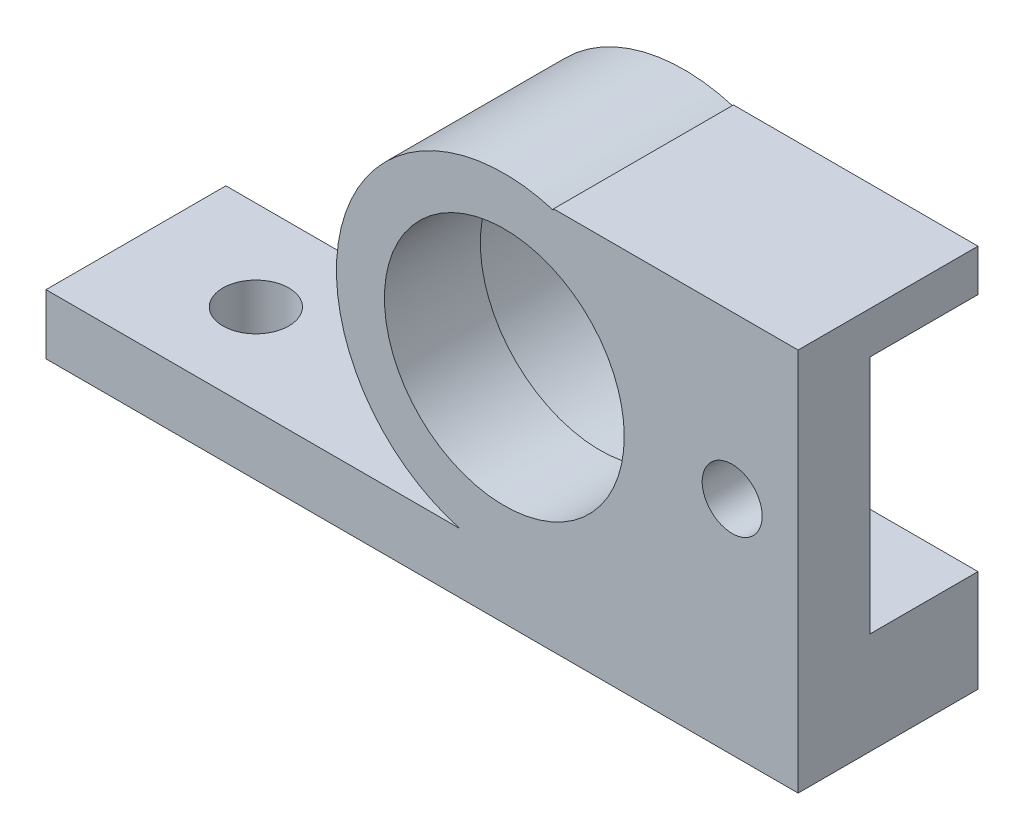
ISO-10303-21;
HEADER;
FILE_DESCRIPTION(('STEP AP214'),'2;1');
FILE_NAME('part.step','',(''),(''),'','','');
FILE_SCHEMA(('AUTOMOTIVE_DESIGN { 1 0 10303 214 1 1 1 1 }'));
ENDSEC;
DATA;
#1=APPLICATION_CONTEXT('core data for automotive mechanical design processes');
#2=APPLICATION_PROTOCOL_DEFINITION('international standard','automotive_design',2000,#1);
#3=PRODUCT_CONTEXT('',#1,'mechanical');
#4=PRODUCT('Part','Part','',(#3));
#5=PRODUCT_RELATED_PRODUCT_CATEGORY('part','',(#4));
#6=PRODUCT_DEFINITION_FORMATION('','',#4);
#7=PRODUCT_DEFINITION_CONTEXT('part definition',#1,'design');
#8=PRODUCT_DEFINITION('design','',#6,#7);
#9=PRODUCT_DEFINITION_SHAPE('','',#8);
#10=(LENGTH_UNIT() NAMED_UNIT(*) SI_UNIT(.MILLI.,.METRE.));
#11=(NAMED_UNIT(*) PLANE_ANGLE_UNIT() SI_UNIT($,.RADIAN.));
#12=(NAMED_UNIT(*) SI_UNIT($,.STERADIAN.) SOLID_ANGLE_UNIT());
#13=UNCERTAINTY_MEASURE_WITH_UNIT(LENGTH_MEASURE(1.E-05),#10,'distance_accuracy_value','');
#14=(GEOMETRIC_REPRESENTATION_CONTEXT(3) GLOBAL_UNCERTAINTY_ASSIGNED_CONTEXT((#13)) GLOBAL_UNIT_ASSIGNED_CONTEXT((#10,
#11,#12)) REPRESENTATION_CONTEXT('',''));
#15=CARTESIAN_POINT('',(0.,0.,0.));
#16=DIRECTION('',(0.,0.,1.));
#17=DIRECTION('',(1.,0.,0.));
#18=AXIS2_PLACEMENT_3D('',#15,#16,#17);
#19=CARTESIAN_POINT('',(-31.,0.,-9.));
#20=DIRECTION('',(0.,0.,1.));
#21=DIRECTION('',(1.,0.,0.));
#22=AXIS2_PLACEMENT_3D('',#19,#20,#21);
#23=CYLINDRICAL_SURFACE('',#22,14.);
#24=DIRECTION('',(0.,0.,1.));
#25=VECTOR('',#24,1.);
#26=CARTESIAN_POINT('',(-34.7080992435478,-13.5,-9.));
#27=LINE('',#26,#25);
#28=CARTESIAN_POINT('',(-34.7080992435478,-13.5,6.));
#29=VERTEX_POINT('',#28);
#30=CARTESIAN_POINT('',(-34.7080992435478,-13.5,-9.));
#31=VERTEX_POINT('',#30);
#32=EDGE_CURVE('E166',#29,#31,#27,.F.);
#33=ORIENTED_EDGE('',*,*,#32,.F.);
#34=CARTESIAN_POINT('',(-31.,0.,6.));
#35=DIRECTION('',(0.,0.,1.));
#36=DIRECTION('',(1.,0.,0.));
#37=AXIS2_PLACEMENT_3D('',#34,#35,#36);
#38=CIRCLE('',#37,14.);
#39=CARTESIAN_POINT('',(-26.8939671408107,13.3843376436512,6.));
#40=VERTEX_POINT('',#39);
#41=EDGE_CURVE('E192',#40,#29,#38,.T.);
#42=ORIENTED_EDGE('',*,*,#41,.F.);
#43=DIRECTION('',(0.,0.,1.));
#44=VECTOR('',#43,1.);
#45=CARTESIAN_POINT('',(-26.8939671408107,13.3843376436512,-9.));
#46=LINE('',#45,#44);
#47=CARTESIAN_POINT('',(-26.8939671408107,13.3843376436512,-9.));
#48=VERTEX_POINT('',#47);
#49=EDGE_CURVE('E239',#48,#40,#46,.T.);
#50=ORIENTED_EDGE('',*,*,#49,.F.);
#51=CARTESIAN_POINT('',(-31.,0.,-9.));
#52=DIRECTION('',(0.,0.,1.));
#53=DIRECTION('',(1.,0.,0.));
#54=AXIS2_PLACEMENT_3D('',#51,#52,#53);
#55=CIRCLE('',#54,14.);
#56=EDGE_CURVE('E209',#48,#31,#55,.T.);
#57=ORIENTED_EDGE('',*,*,#56,.T.);
#58=EDGE_LOOP('',(#33,#42,#50,#57));
#59=FACE_BOUND('',#58,.T.);
#60=ADVANCED_FACE('F44',(#59),#23,.T.);
#61=CARTESIAN_POINT('',(-31.,0.,-9.));
#62=DIRECTION('',(0.,0.,1.));
#63=DIRECTION('',(1.,0.,0.));
#64=AXIS2_PLACEMENT_3D('',#61,#62,#63);
#65=CYLINDRICAL_SURFACE('',#64,11.);
#66=CARTESIAN_POINT('',(-31.,0.,-9.));
#67=DIRECTION('',(0.,0.,1.));
#68=DIRECTION('',(1.,0.,0.));
#69=AXIS2_PLACEMENT_3D('',#66,#67,#68);
#70=CIRCLE('',#69,11.);
#71=CARTESIAN_POINT('',(-20.,0.,-9.));
#72=VERTEX_POINT('',#71);
#73=EDGE_CURVE('E187',#72,#72,#70,.T.);
#74=ORIENTED_EDGE('',*,*,#73,.F.);
#75=EDGE_LOOP('',(#74));
#76=FACE_BOUND('',#75,.T.);
#77=CARTESIAN_POINT('',(-31.,0.,-2.));
#78=DIRECTION('',(0.,0.,1.));
#79=DIRECTION('',(1.,0.,0.));
#80=AXIS2_PLACEMENT_3D('',#77,#78,#79);
#81=CIRCLE('',#80,11.);
#82=CARTESIAN_POINT('',(-20.,0.,-2.));
#83=VERTEX_POINT('',#82);
#84=EDGE_CURVE('E11',#83,#83,#81,.F.);
#85=ORIENTED_EDGE('',*,*,#84,.F.);
#86=EDGE_LOOP('',(#85));
#87=FACE_BOUND('',#86,.T.);
#88=ADVANCED_FACE('F317',(#76,#87),#65,.F.);
#89=CARTESIAN_POINT('',(0.,0.,6.));
#90=DIRECTION('',(0.,0.,1.));
#91=DIRECTION('',(1.,0.,0.));
#92=AXIS2_PLACEMENT_3D('',#89,#90,#91);
#93=PLANE('',#92);
#94=DIRECTION('',(0.,1.,0.));
#95=VECTOR('',#94,1.);
#96=CARTESIAN_POINT('',(-69.2198374810022,0.,6.));
#97=LINE('',#96,#95);
#98=CARTESIAN_POINT('',(-69.2198374810022,-18.5,6.));
#99=VERTEX_POINT('',#98);
#100=CARTESIAN_POINT('',(-69.2198374810022,-13.5,6.));
#101=VERTEX_POINT('',#100);
#102=EDGE_CURVE('E141',#99,#101,#97,.T.);
#103=ORIENTED_EDGE('',*,*,#102,.F.);
#104=DIRECTION('',(1.,0.,0.));
#105=VECTOR('',#104,1.);
#106=CARTESIAN_POINT('',(-480.,-18.5,6.));
#107=LINE('',#106,#105);
#108=CARTESIAN_POINT('',(-6.50000000000001,-18.5,6.));
#109=VERTEX_POINT('',#108);
#110=EDGE_CURVE('E68',#99,#109,#107,.T.);
#111=ORIENTED_EDGE('',*,*,#110,.T.);
#112=DIRECTION('',(0.,-1.,0.));
#113=VECTOR('',#112,1.);
#114=CARTESIAN_POINT('',(-6.5,13.5,6.));
#115=LINE('',#114,#113);
#116=CARTESIAN_POINT('',(-6.5,13.5,6.));
#117=VERTEX_POINT('',#116);
#118=EDGE_CURVE('E155',#117,#109,#115,.T.);
#119=ORIENTED_EDGE('',*,*,#118,.F.);
#120=DIRECTION('',(-1.,0.,0.));
#121=VECTOR('',#120,1.);
#122=CARTESIAN_POINT('',(0.,13.5,6.));
#123=LINE('',#122,#121);
#124=CARTESIAN_POINT('',(-26.8939671408107,13.5,6.));
#125=VERTEX_POINT('',#124);
#126=EDGE_CURVE('E183',#117,#125,#123,.T.);
#127=ORIENTED_EDGE('',*,*,#126,.T.);
#128=DIRECTION('',(0.,1.,0.));
#129=VECTOR('',#128,1.);
#130=CARTESIAN_POINT('',(-26.8939671408107,0.,6.));
#131=LINE('',#130,#129);
#132=EDGE_CURVE('E224',#40,#125,#131,.T.);
#133=ORIENTED_EDGE('',*,*,#132,.F.);
#134=ORIENTED_EDGE('',*,*,#41,.T.);
#135=DIRECTION('',(1.,0.,0.));
#136=VECTOR('',#135,1.);
#137=CARTESIAN_POINT('',(-480.,-13.5,6.));
#138=LINE('',#137,#136);
#139=EDGE_CURVE('E153',#101,#29,#138,.T.);
#140=ORIENTED_EDGE('',*,*,#139,.F.);
#141=EDGE_LOOP('',(#103,#111,#119,#127,#133,#134,#140));
#142=FACE_BOUND('',#141,.T.);
#143=CARTESIAN_POINT('',(-12.,-1.53625178909098E-13,6.));
#144=DIRECTION('',(0.,0.,1.));
#145=DIRECTION('',(1.,0.,0.));
#146=AXIS2_PLACEMENT_3D('',#143,#144,#145);
#147=CIRCLE('',#146,2.5);
#148=CARTESIAN_POINT('',(-9.5,-1.53625178909098E-13,6.));
#149=VERTEX_POINT('',#148);
#150=EDGE_CURVE('E253',#149,#149,#147,.T.);
#151=ORIENTED_EDGE('',*,*,#150,.F.);
#152=EDGE_LOOP('',(#151));
#153=FACE_BOUND('',#152,.T.);
#154=CARTESIAN_POINT('',(-31.,0.,6.));
#155=DIRECTION('',(0.,0.,1.));
#156=DIRECTION('',(1.,0.,0.));
#157=AXIS2_PLACEMENT_3D('',#154,#155,#156);
#158=CIRCLE('',#157,10.);
#159=CARTESIAN_POINT('',(-21.,0.,6.));
#160=VERTEX_POINT('',#159);
#161=EDGE_CURVE('E178',#160,#160,#158,.T.);
#162=ORIENTED_EDGE('',*,*,#161,.F.);
#163=EDGE_LOOP('',(#162));
#164=FACE_BOUND('',#163,.T.);
#165=ADVANCED_FACE('F150',(#142,#153,#164),#93,.T.);
#166=CARTESIAN_POINT('',(0.,0.,0.));
#167=DIRECTION('',(0.,0.,1.));
#168=DIRECTION('',(1.,0.,0.));
#169=AXIS2_PLACEMENT_3D('',#166,#167,#168);
#170=PLANE('',#169);
#171=CARTESIAN_POINT('',(-12.,-1.53625178909098E-13,0.));
#172=DIRECTION('',(0.,0.,1.));
#173=DIRECTION('',(1.,0.,0.));
#174=AXIS2_PLACEMENT_3D('',#171,#172,#173);
#175=CIRCLE('',#174,2.5);
#176=CARTESIAN_POINT('',(-9.5,-1.53625178909098E-13,0.));
#177=VERTEX_POINT('',#176);
#178=EDGE_CURVE('E234',#177,#177,#175,.T.);
#179=ORIENTED_EDGE('',*,*,#178,.T.);
#180=EDGE_LOOP('',(#179));
#181=FACE_BOUND('',#180,.T.);
#182=DIRECTION('',(-1.,0.,0.));
#183=VECTOR('',#182,1.);
#184=CARTESIAN_POINT('',(20.,10.,0.));
#185=LINE('',#184,#183);
#186=CARTESIAN_POINT('',(-6.5,10.,0.));
#187=VERTEX_POINT('',#186);
#188=CARTESIAN_POINT('',(-20.,10.,0.));
#189=VERTEX_POINT('',#188);
#190=EDGE_CURVE('E269',#187,#189,#185,.T.);
#191=ORIENTED_EDGE('',*,*,#190,.F.);
#192=DIRECTION('',(0.,-1.,0.));
#193=VECTOR('',#192,1.);
#194=CARTESIAN_POINT('',(-6.5,0.,0.));
#195=LINE('',#194,#193);
#196=CARTESIAN_POINT('',(-6.5,-10.,0.));
#197=VERTEX_POINT('',#196);
#198=EDGE_CURVE('E296',#187,#197,#195,.T.);
#199=ORIENTED_EDGE('',*,*,#198,.T.);
#200=DIRECTION('',(1.,0.,0.));
#201=VECTOR('',#200,1.);
#202=CARTESIAN_POINT('',(20.,-10.,0.));
#203=LINE('',#202,#201);
#204=CARTESIAN_POINT('',(-20.,-10.,0.));
#205=VERTEX_POINT('',#204);
#206=EDGE_CURVE('E265',#205,#197,#203,.T.);
#207=ORIENTED_EDGE('',*,*,#206,.F.);
#208=DIRECTION('',(0.,-1.,0.));
#209=VECTOR('',#208,1.);
#210=CARTESIAN_POINT('',(-20.,-10.,0.));
#211=LINE('',#210,#209);
#212=CARTESIAN_POINT('',(-20.,-8.66025403784439,0.));
#213=VERTEX_POINT('',#212);
#214=EDGE_CURVE('E257',#213,#205,#211,.T.);
#215=ORIENTED_EDGE('',*,*,#214,.F.);
#216=CARTESIAN_POINT('',(-31.,0.,0.));
#217=DIRECTION('',(0.,0.,1.));
#218=DIRECTION('',(1.,0.,0.));
#219=AXIS2_PLACEMENT_3D('',#216,#217,#218);
#220=CIRCLE('',#219,14.);
#221=CARTESIAN_POINT('',(-20.,8.66025403784439,0.));
#222=VERTEX_POINT('',#221);
#223=EDGE_CURVE('E53',#213,#222,#220,.T.);
#224=ORIENTED_EDGE('',*,*,#223,.T.);
#225=EDGE_CURVE('E261',#189,#222,#211,.T.);
#226=ORIENTED_EDGE('',*,*,#225,.F.);
#227=EDGE_LOOP('',(#191,#199,#207,#215,#224,#226));
#228=FACE_BOUND('',#227,.T.);
#229=ADVANCED_FACE('F46',(#181,#228),#170,.F.);
#230=CARTESIAN_POINT('',(-12.,-1.53625178909098E-13,0.));
#231=DIRECTION('',(0.,0.,1.));
#232=DIRECTION('',(1.,0.,0.));
#233=AXIS2_PLACEMENT_3D('',#230,#231,#232);
#234=CYLINDRICAL_SURFACE('',#233,2.5);
#235=ORIENTED_EDGE('',*,*,#178,.F.);
#236=EDGE_LOOP('',(#235));
#237=FACE_BOUND('',#236,.T.);
#238=ORIENTED_EDGE('',*,*,#150,.T.);
#239=EDGE_LOOP('',(#238));
#240=FACE_BOUND('',#239,.T.);
#241=ADVANCED_FACE('F313',(#237,#240),#234,.F.);
#242=CARTESIAN_POINT('',(-31.,0.,-9.));
#243=DIRECTION('',(0.,0.,1.));
#244=DIRECTION('',(1.,0.,0.));
#245=AXIS2_PLACEMENT_3D('',#242,#243,#244);
#246=CYLINDRICAL_SURFACE('',#245,14.);
#247=ORIENTED_EDGE('',*,*,#223,.F.);
#248=DIRECTION('',(0.,0.,1.));
#249=VECTOR('',#248,1.);
#250=CARTESIAN_POINT('',(-20.,-8.66025403784439,-9.));
#251=LINE('',#250,#249);
#252=CARTESIAN_POINT('',(-20.,-8.66025403784439,-9.));
#253=VERTEX_POINT('',#252);
#254=EDGE_CURVE('E230',#253,#213,#251,.T.);
#255=ORIENTED_EDGE('',*,*,#254,.F.);
#256=CARTESIAN_POINT('',(-31.,0.,-9.));
#257=DIRECTION('',(0.,0.,1.));
#258=DIRECTION('',(1.,0.,0.));
#259=AXIS2_PLACEMENT_3D('',#256,#257,#258);
#260=CIRCLE('',#259,14.);
#261=CARTESIAN_POINT('',(-20.,8.66025403784439,-9.));
#262=VERTEX_POINT('',#261);
#263=EDGE_CURVE('E191',#253,#262,#260,.T.);
#264=ORIENTED_EDGE('',*,*,#263,.T.);
#265=DIRECTION('',(0.,0.,1.));
#266=VECTOR('',#265,1.);
#267=CARTESIAN_POINT('',(-20.,8.66025403784439,-9.));
#268=LINE('',#267,#266);
#269=EDGE_CURVE('E221',#262,#222,#268,.T.);
#270=ORIENTED_EDGE('',*,*,#269,.T.);
#271=EDGE_LOOP('',(#247,#255,#264,#270));
#272=FACE_BOUND('',#271,.T.);
#273=ADVANCED_FACE('F283',(#272),#246,.T.);
#274=CARTESIAN_POINT('',(-20.,0.,-9.));
#275=DIRECTION('',(-1.,0.,0.));
#276=DIRECTION('',(0.,0.,1.));
#277=AXIS2_PLACEMENT_3D('',#274,#275,#276);
#278=PLANE('',#277);
#279=ORIENTED_EDGE('',*,*,#254,.T.);
#280=ORIENTED_EDGE('',*,*,#214,.T.);
#281=DIRECTION('',(0.,0.,1.));
#282=VECTOR('',#281,1.);
#283=CARTESIAN_POINT('',(-20.,-10.,-9.));
#284=LINE('',#283,#282);
#285=CARTESIAN_POINT('',(-20.,-10.,-9.));
#286=VERTEX_POINT('',#285);
#287=EDGE_CURVE('E235',#286,#205,#284,.T.);
#288=ORIENTED_EDGE('',*,*,#287,.F.);
#289=DIRECTION('',(0.,-1.,0.));
#290=VECTOR('',#289,1.);
#291=CARTESIAN_POINT('',(-20.,0.,-9.));
#292=LINE('',#291,#290);
#293=EDGE_CURVE('E217',#253,#286,#292,.T.);
#294=ORIENTED_EDGE('',*,*,#293,.F.);
#295=EDGE_LOOP('',(#279,#280,#288,#294));
#296=FACE_BOUND('',#295,.T.);
#297=ADVANCED_FACE('F304',(#296),#278,.F.);
#298=CARTESIAN_POINT('',(0.,-10.,-9.));
#299=DIRECTION('',(0.,-1.,0.));
#300=DIRECTION('',(1.,0.,0.));
#301=AXIS2_PLACEMENT_3D('',#298,#299,#300);
#302=PLANE('',#301);
#303=ORIENTED_EDGE('',*,*,#206,.T.);
#304=DIRECTION('',(0.,0.,-1.));
#305=VECTOR('',#304,1.);
#306=CARTESIAN_POINT('',(-6.5,-10.,-9.));
#307=LINE('',#306,#305);
#308=CARTESIAN_POINT('',(-6.5,-10.,-9.));
#309=VERTEX_POINT('',#308);
#310=EDGE_CURVE('E174',#197,#309,#307,.T.);
#311=ORIENTED_EDGE('',*,*,#310,.T.);
#312=DIRECTION('',(1.,0.,0.));
#313=VECTOR('',#312,1.);
#314=CARTESIAN_POINT('',(0.,-10.,-9.));
#315=LINE('',#314,#313);
#316=EDGE_CURVE('E213',#286,#309,#315,.T.);
#317=ORIENTED_EDGE('',*,*,#316,.F.);
#318=ORIENTED_EDGE('',*,*,#287,.T.);
#319=EDGE_LOOP('',(#303,#311,#317,#318));
#320=FACE_BOUND('',#319,.T.);
#321=ADVANCED_FACE('F302',(#320),#302,.F.);
#322=CARTESIAN_POINT('',(0.,10.,-9.));
#323=DIRECTION('',(0.,1.,0.));
#324=DIRECTION('',(-1.,0.,0.));
#325=AXIS2_PLACEMENT_3D('',#322,#323,#324);
#326=PLANE('',#325);
#327=DIRECTION('',(-1.,0.,0.));
#328=VECTOR('',#327,1.);
#329=CARTESIAN_POINT('',(0.,10.,-9.));
#330=LINE('',#329,#328);
#331=CARTESIAN_POINT('',(-6.5,10.,-9.));
#332=VERTEX_POINT('',#331);
#333=CARTESIAN_POINT('',(-20.,10.,-9.));
#334=VERTEX_POINT('',#333);
#335=EDGE_CURVE('E199',#332,#334,#330,.T.);
#336=ORIENTED_EDGE('',*,*,#335,.F.);
#337=DIRECTION('',(0.,0.,1.));
#338=VECTOR('',#337,1.);
#339=CARTESIAN_POINT('',(-6.5,10.,-9.));
#340=LINE('',#339,#338);
#341=EDGE_CURVE('E294',#332,#187,#340,.T.);
#342=ORIENTED_EDGE('',*,*,#341,.T.);
#343=ORIENTED_EDGE('',*,*,#190,.T.);
#344=DIRECTION('',(0.,0.,1.));
#345=VECTOR('',#344,1.);
#346=CARTESIAN_POINT('',(-20.,10.,-9.));
#347=LINE('',#346,#345);
#348=EDGE_CURVE('E246',#334,#189,#347,.T.);
#349=ORIENTED_EDGE('',*,*,#348,.F.);
#350=EDGE_LOOP('',(#336,#342,#343,#349));
#351=FACE_BOUND('',#350,.T.);
#352=ADVANCED_FACE('F292',(#351),#326,.F.);
#353=CARTESIAN_POINT('',(-20.,0.,-9.));
#354=DIRECTION('',(-1.,0.,0.));
#355=DIRECTION('',(0.,0.,1.));
#356=AXIS2_PLACEMENT_3D('',#353,#354,#355);
#357=PLANE('',#356);
#358=ORIENTED_EDGE('',*,*,#348,.T.);
#359=ORIENTED_EDGE('',*,*,#225,.T.);
#360=ORIENTED_EDGE('',*,*,#269,.F.);
#361=DIRECTION('',(0.,-1.,0.));
#362=VECTOR('',#361,1.);
#363=CARTESIAN_POINT('',(-20.,0.,-9.));
#364=LINE('',#363,#362);
#365=EDGE_CURVE('E196',#334,#262,#364,.T.);
#366=ORIENTED_EDGE('',*,*,#365,.F.);
#367=EDGE_LOOP('',(#358,#359,#360,#366));
#368=FACE_BOUND('',#367,.T.);
#369=ADVANCED_FACE('F280',(#368),#357,.F.);
#370=CARTESIAN_POINT('',(-26.8939671408107,0.,-9.));
#371=DIRECTION('',(1.,0.,0.));
#372=DIRECTION('',(0.,0.,-1.));
#373=AXIS2_PLACEMENT_3D('',#370,#371,#372);
#374=PLANE('',#373);
#375=ORIENTED_EDGE('',*,*,#132,.T.);
#376=DIRECTION('',(0.,0.,1.));
#377=VECTOR('',#376,1.);
#378=CARTESIAN_POINT('',(-26.8939671408107,13.5,-9.));
#379=LINE('',#378,#377);
#380=CARTESIAN_POINT('',(-26.8939671408107,13.5,-9.));
#381=VERTEX_POINT('',#380);
#382=EDGE_CURVE('E242',#381,#125,#379,.T.);
#383=ORIENTED_EDGE('',*,*,#382,.F.);
#384=DIRECTION('',(0.,1.,0.));
#385=VECTOR('',#384,1.);
#386=CARTESIAN_POINT('',(-26.8939671408107,0.,-9.));
#387=LINE('',#386,#385);
#388=EDGE_CURVE('E205',#48,#381,#387,.T.);
#389=ORIENTED_EDGE('',*,*,#388,.F.);
#390=ORIENTED_EDGE('',*,*,#49,.T.);
#391=EDGE_LOOP('',(#375,#383,#389,#390));
#392=FACE_BOUND('',#391,.T.);
#393=ADVANCED_FACE('F327',(#392),#374,.F.);
#394=CARTESIAN_POINT('',(0.,13.5,-9.));
#395=DIRECTION('',(0.,1.,0.));
#396=DIRECTION('',(-1.,0.,0.));
#397=AXIS2_PLACEMENT_3D('',#394,#395,#396);
#398=PLANE('',#397);
#399=DIRECTION('',(0.,0.,1.));
#400=VECTOR('',#399,1.);
#401=CARTESIAN_POINT('',(-6.5,13.5,-9.));
#402=LINE('',#401,#400);
#403=CARTESIAN_POINT('',(-6.5,13.5,-9.));
#404=VERTEX_POINT('',#403);
#405=EDGE_CURVE('E521',#404,#117,#402,.T.);
#406=ORIENTED_EDGE('',*,*,#405,.F.);
#407=DIRECTION('',(-1.,0.,0.));
#408=VECTOR('',#407,1.);
#409=CARTESIAN_POINT('',(0.,13.5,-9.));
#410=LINE('',#409,#408);
#411=EDGE_CURVE('E202',#404,#381,#410,.T.);
#412=ORIENTED_EDGE('',*,*,#411,.T.);
#413=ORIENTED_EDGE('',*,*,#382,.T.);
#414=ORIENTED_EDGE('',*,*,#126,.F.);
#415=EDGE_LOOP('',(#406,#412,#413,#414));
#416=FACE_BOUND('',#415,.T.);
#417=ADVANCED_FACE('F330',(#416),#398,.T.);
#418=CARTESIAN_POINT('',(0.,0.,-9.));
#419=DIRECTION('',(0.,0.,1.));
#420=DIRECTION('',(1.,0.,0.));
#421=AXIS2_PLACEMENT_3D('',#418,#419,#420);
#422=PLANE('',#421);
#423=ORIENTED_EDGE('',*,*,#73,.T.);
#424=EDGE_LOOP('',(#423));
#425=FACE_BOUND('',#424,.T.);
#426=DIRECTION('',(1.,0.,0.));
#427=VECTOR('',#426,1.);
#428=CARTESIAN_POINT('',(-480.,-18.5,-9.));
#429=LINE('',#428,#427);
#430=CARTESIAN_POINT('',(-69.2198374810022,-18.5,-9.));
#431=VERTEX_POINT('',#430);
#432=CARTESIAN_POINT('',(-6.5,-18.5,-9.));
#433=VERTEX_POINT('',#432);
#434=EDGE_CURVE('E162',#431,#433,#429,.T.);
#435=ORIENTED_EDGE('',*,*,#434,.F.);
#436=DIRECTION('',(0.,1.,0.));
#437=VECTOR('',#436,1.);
#438=CARTESIAN_POINT('',(-69.2198374810022,0.,-9.));
#439=LINE('',#438,#437);
#440=CARTESIAN_POINT('',(-69.2198374810022,-13.5,-9.));
#441=VERTEX_POINT('',#440);
#442=EDGE_CURVE('E60',#431,#441,#439,.T.);
#443=ORIENTED_EDGE('',*,*,#442,.T.);
#444=DIRECTION('',(1.,0.,0.));
#445=VECTOR('',#444,1.);
#446=CARTESIAN_POINT('',(-480.,-13.5,-9.));
#447=LINE('',#446,#445);
#448=EDGE_CURVE('E168',#441,#31,#447,.T.);
#449=ORIENTED_EDGE('',*,*,#448,.T.);
#450=ORIENTED_EDGE('',*,*,#56,.F.);
#451=ORIENTED_EDGE('',*,*,#388,.T.);
#452=ORIENTED_EDGE('',*,*,#411,.F.);
#453=DIRECTION('',(0.,-1.,0.));
#454=VECTOR('',#453,1.);
#455=CARTESIAN_POINT('',(-6.5,13.5,-9.));
#456=LINE('',#455,#454);
#457=EDGE_CURVE('E515',#404,#332,#456,.T.);
#458=ORIENTED_EDGE('',*,*,#457,.T.);
#459=ORIENTED_EDGE('',*,*,#335,.T.);
#460=ORIENTED_EDGE('',*,*,#365,.T.);
#461=ORIENTED_EDGE('',*,*,#263,.F.);
#462=ORIENTED_EDGE('',*,*,#293,.T.);
#463=ORIENTED_EDGE('',*,*,#316,.T.);
#464=EDGE_CURVE('E518',#309,#433,#456,.T.);
#465=ORIENTED_EDGE('',*,*,#464,.T.);
#466=EDGE_LOOP('',(#435,#443,#449,#450,#451,#452,#458,#459,#460,#461,#462,#463,#465));
#467=FACE_BOUND('',#466,.T.);
#468=ADVANCED_FACE('F287',(#425,#467),#422,.F.);
#469=CARTESIAN_POINT('',(-31.,0.,-2.));
#470=DIRECTION('',(0.,0.,1.));
#471=DIRECTION('',(1.,0.,0.));
#472=AXIS2_PLACEMENT_3D('',#469,#470,#471);
#473=PLANE('',#472);
#474=CARTESIAN_POINT('',(-31.,0.,-2.));
#475=DIRECTION('',(0.,0.,1.));
#476=DIRECTION('',(1.,0.,0.));
#477=AXIS2_PLACEMENT_3D('',#474,#475,#476);
#478=CIRCLE('',#477,10.);
#479=CARTESIAN_POINT('',(-21.,0.,-2.));
#480=VERTEX_POINT('',#479);
#481=EDGE_CURVE('E179',#480,#480,#478,.T.);
#482=ORIENTED_EDGE('',*,*,#481,.T.);
#483=EDGE_LOOP('',(#482));
#484=FACE_BOUND('',#483,.T.);
#485=ORIENTED_EDGE('',*,*,#84,.T.);
#486=EDGE_LOOP('',(#485));
#487=FACE_BOUND('',#486,.T.);
#488=ADVANCED_FACE('F357',(#484,#487),#473,.F.);
#489=CARTESIAN_POINT('',(-31.,0.,-2.));
#490=DIRECTION('',(0.,0.,1.));
#491=DIRECTION('',(1.,0.,0.));
#492=AXIS2_PLACEMENT_3D('',#489,#490,#491);
#493=CYLINDRICAL_SURFACE('',#492,10.);
#494=ORIENTED_EDGE('',*,*,#481,.F.);
#495=EDGE_LOOP('',(#494));
#496=FACE_BOUND('',#495,.T.);
#497=ORIENTED_EDGE('',*,*,#161,.T.);
#498=EDGE_LOOP('',(#497));
#499=FACE_BOUND('',#498,.T.);
#500=ADVANCED_FACE('F354',(#496,#499),#493,.F.);
#501=CARTESIAN_POINT('',(-480.,-13.5,-9.));
#502=DIRECTION('',(0.,1.,0.));
#503=DIRECTION('',(0.,0.,1.));
#504=AXIS2_PLACEMENT_3D('',#501,#502,#503);
#505=PLANE('',#504);
#506=CARTESIAN_POINT('',(-59.2198374810022,-13.5,-1.5));
#507=DIRECTION('',(0.,1.,0.));
#508=DIRECTION('',(0.,0.,1.));
#509=AXIS2_PLACEMENT_3D('',#506,#507,#508);
#510=CIRCLE('',#509,2.75);
#511=CARTESIAN_POINT('',(-59.2198374810022,-13.5,1.25));
#512=VERTEX_POINT('',#511);
#513=EDGE_CURVE('E147',#512,#512,#510,.T.);
#514=ORIENTED_EDGE('',*,*,#513,.F.);
#515=EDGE_LOOP('',(#514));
#516=FACE_BOUND('',#515,.T.);
#517=DIRECTION('',(0.,0.,-1.));
#518=VECTOR('',#517,1.);
#519=CARTESIAN_POINT('',(-69.2198374810022,-13.5,-9.));
#520=LINE('',#519,#518);
#521=EDGE_CURVE('E146',#101,#441,#520,.T.);
#522=ORIENTED_EDGE('',*,*,#521,.F.);
#523=ORIENTED_EDGE('',*,*,#139,.T.);
#524=ORIENTED_EDGE('',*,*,#32,.T.);
#525=ORIENTED_EDGE('',*,*,#448,.F.);
#526=EDGE_LOOP('',(#522,#523,#524,#525));
#527=FACE_BOUND('',#526,.T.);
#528=ADVANCED_FACE('F356',(#516,#527),#505,.T.);
#529=CARTESIAN_POINT('',(-480.,-18.5,-9.));
#530=DIRECTION('',(0.,-1.,0.));
#531=DIRECTION('',(0.,0.,-1.));
#532=AXIS2_PLACEMENT_3D('',#529,#530,#531);
#533=PLANE('',#532);
#534=CARTESIAN_POINT('',(-59.2198374810022,-18.5,-1.5));
#535=DIRECTION('',(0.,-1.,0.));
#536=DIRECTION('',(0.,0.,-1.));
#537=AXIS2_PLACEMENT_3D('',#534,#535,#536);
#538=CIRCLE('',#537,2.75);
#539=CARTESIAN_POINT('',(-59.2198374810022,-18.5,-4.25000000000001));
#540=VERTEX_POINT('',#539);
#541=EDGE_CURVE('E505',#540,#540,#538,.T.);
#542=ORIENTED_EDGE('',*,*,#541,.F.);
#543=EDGE_LOOP('',(#542));
#544=FACE_BOUND('',#543,.T.);
#545=DIRECTION('',(0.,0.,1.));
#546=VECTOR('',#545,1.);
#547=CARTESIAN_POINT('',(-69.2198374810022,-18.5,-9.04908073041211));
#548=LINE('',#547,#546);
#549=EDGE_CURVE('E139',#431,#99,#548,.T.);
#550=ORIENTED_EDGE('',*,*,#549,.F.);
#551=ORIENTED_EDGE('',*,*,#434,.T.);
#552=DIRECTION('',(0.,0.,1.));
#553=VECTOR('',#552,1.);
#554=CARTESIAN_POINT('',(-6.5,-18.5,-9.));
#555=LINE('',#554,#553);
#556=EDGE_CURVE('E160',#433,#109,#555,.T.);
#557=ORIENTED_EDGE('',*,*,#556,.T.);
#558=ORIENTED_EDGE('',*,*,#110,.F.);
#559=EDGE_LOOP('',(#550,#551,#557,#558));
#560=FACE_BOUND('',#559,.T.);
#561=ADVANCED_FACE('F158',(#544,#560),#533,.T.);
#562=CARTESIAN_POINT('',(-6.5,13.5,-9.));
#563=DIRECTION('',(-1.,0.,0.));
#564=DIRECTION('',(0.,0.,1.));
#565=AXIS2_PLACEMENT_3D('',#562,#563,#564);
#566=PLANE('',#565);
#567=ORIENTED_EDGE('',*,*,#198,.F.);
#568=ORIENTED_EDGE('',*,*,#341,.F.);
#569=ORIENTED_EDGE('',*,*,#457,.F.);
#570=ORIENTED_EDGE('',*,*,#405,.T.);
#571=ORIENTED_EDGE('',*,*,#118,.T.);
#572=ORIENTED_EDGE('',*,*,#556,.F.);
#573=ORIENTED_EDGE('',*,*,#464,.F.);
#574=ORIENTED_EDGE('',*,*,#310,.F.);
#575=EDGE_LOOP('',(#567,#568,#569,#570,#571,#572,#573,#574));
#576=FACE_BOUND('',#575,.T.);
#577=ADVANCED_FACE('F435',(#576),#566,.F.);
#578=CARTESIAN_POINT('',(-69.2198374810022,14.,-9.0490807304121));
#579=DIRECTION('',(1.,0.,0.));
#580=DIRECTION('',(0.,0.,-1.));
#581=AXIS2_PLACEMENT_3D('',#578,#579,#580);
#582=PLANE('',#581);
#583=ORIENTED_EDGE('',*,*,#102,.T.);
#584=ORIENTED_EDGE('',*,*,#521,.T.);
#585=ORIENTED_EDGE('',*,*,#442,.F.);
#586=ORIENTED_EDGE('',*,*,#549,.T.);
#587=EDGE_LOOP('',(#583,#584,#585,#586));
#588=FACE_BOUND('',#587,.T.);
#589=ADVANCED_FACE('F140',(#588),#582,.F.);
#590=CARTESIAN_POINT('',(-59.2198374810022,-8.5,-1.5));
#591=DIRECTION('',(0.,-1.,0.));
#592=DIRECTION('',(0.,0.,-1.));
#593=AXIS2_PLACEMENT_3D('',#590,#591,#592);
#594=CYLINDRICAL_SURFACE('',#593,2.75);
#595=ORIENTED_EDGE('',*,*,#513,.T.);
#596=EDGE_LOOP('',(#595));
#597=FACE_BOUND('',#596,.T.);
#598=ORIENTED_EDGE('',*,*,#541,.T.);
#599=EDGE_LOOP('',(#598));
#600=FACE_BOUND('',#599,.T.);
#601=ADVANCED_FACE('F481',(#597,#600),#594,.F.);
#602=CLOSED_SHELL('',(#60,#88,#165,#229,#241,#273,#297,#321,#352,#369,#393,#417,#468,#488,#500,
#528,#561,#577,#589,#601));
#603=MANIFOLD_SOLID_BREP('B2',#602);
#604=ADVANCED_BREP_SHAPE_REPRESENTATION('',(#18,#603),#14);
#605=SHAPE_DEFINITION_REPRESENTATION(#9,#604);
ENDSEC;
END-ISO-10303-21;
